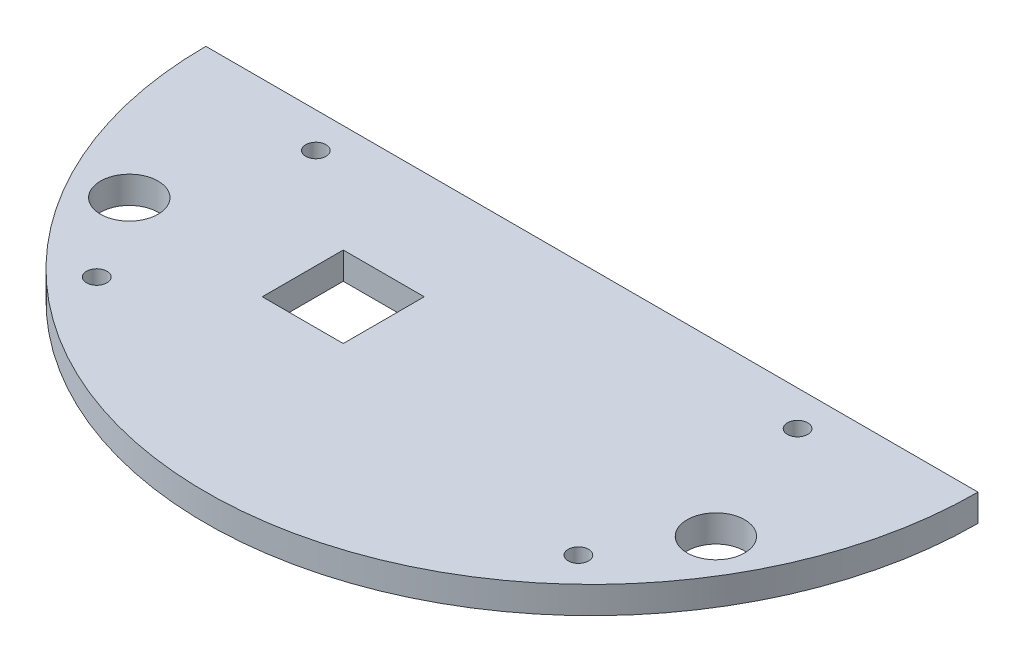
ISO-10303-21;
HEADER;
FILE_DESCRIPTION(('STEP AP214'),'2;1');
FILE_NAME('part.step','',(''),(''),'','','');
FILE_SCHEMA(('AUTOMOTIVE_DESIGN { 1 0 10303 214 1 1 1 1 }'));
ENDSEC;
DATA;
#1=APPLICATION_CONTEXT('core data for automotive mechanical design processes');
#2=APPLICATION_PROTOCOL_DEFINITION('international standard','automotive_design',2000,#1);
#3=PRODUCT_CONTEXT('',#1,'mechanical');
#4=PRODUCT('Part','Part','',(#3));
#5=PRODUCT_RELATED_PRODUCT_CATEGORY('part','',(#4));
#6=PRODUCT_DEFINITION_FORMATION('','',#4);
#7=PRODUCT_DEFINITION_CONTEXT('part definition',#1,'design');
#8=PRODUCT_DEFINITION('design','',#6,#7);
#9=PRODUCT_DEFINITION_SHAPE('','',#8);
#10=(LENGTH_UNIT() NAMED_UNIT(*) SI_UNIT(.MILLI.,.METRE.));
#11=(NAMED_UNIT(*) PLANE_ANGLE_UNIT() SI_UNIT($,.RADIAN.));
#12=(NAMED_UNIT(*) SI_UNIT($,.STERADIAN.) SOLID_ANGLE_UNIT());
#13=UNCERTAINTY_MEASURE_WITH_UNIT(LENGTH_MEASURE(1.E-05),#10,'distance_accuracy_value','');
#14=(GEOMETRIC_REPRESENTATION_CONTEXT(3) GLOBAL_UNCERTAINTY_ASSIGNED_CONTEXT((#13)) GLOBAL_UNIT_ASSIGNED_CONTEXT((#10,
#11,#12)) REPRESENTATION_CONTEXT('',''));
#15=CARTESIAN_POINT('',(0.,0.,0.));
#16=DIRECTION('',(0.,0.,1.));
#17=DIRECTION('',(1.,0.,0.));
#18=AXIS2_PLACEMENT_3D('',#15,#16,#17);
#19=CARTESIAN_POINT('',(0.,4.,0.));
#20=DIRECTION('',(0.,1.,0.));
#21=DIRECTION('',(0.,0.,1.));
#22=AXIS2_PLACEMENT_3D('',#19,#20,#21);
#23=PLANE('',#22);
#24=DIRECTION('',(0.,0.,-1.));
#25=VECTOR('',#24,1.);
#26=CARTESIAN_POINT('',(-8.8560853227291,4.,27.8589477043267));
#27=LINE('',#26,#25);
#28=CARTESIAN_POINT('',(-8.8560853227291,4.,27.8589477043267));
#29=VERTEX_POINT('',#28);
#30=CARTESIAN_POINT('',(-8.8560853227291,4.,15.900742441425));
#31=VERTEX_POINT('',#30);
#32=EDGE_CURVE('E48',#29,#31,#27,.T.);
#33=ORIENTED_EDGE('',*,*,#32,.F.);
#34=DIRECTION('',(1.,0.,0.));
#35=VECTOR('',#34,1.);
#36=CARTESIAN_POINT('',(-20.8142905856308,4.,27.8589477043267));
#37=LINE('',#36,#35);
#38=CARTESIAN_POINT('',(-20.8142905856308,4.,27.8589477043267));
#39=VERTEX_POINT('',#38);
#40=EDGE_CURVE('E104',#39,#29,#37,.T.);
#41=ORIENTED_EDGE('',*,*,#40,.F.);
#42=DIRECTION('',(0.,0.,1.));
#43=VECTOR('',#42,1.);
#44=CARTESIAN_POINT('',(-20.8142905856308,4.,27.8589477043267));
#45=LINE('',#44,#43);
#46=CARTESIAN_POINT('',(-20.8142905856308,4.,15.900742441425));
#47=VERTEX_POINT('',#46);
#48=EDGE_CURVE('E107',#47,#39,#45,.T.);
#49=ORIENTED_EDGE('',*,*,#48,.F.);
#50=DIRECTION('',(-1.,0.,0.));
#51=VECTOR('',#50,1.);
#52=CARTESIAN_POINT('',(-20.8142905856308,4.,15.900742441425));
#53=LINE('',#52,#51);
#54=EDGE_CURVE('E113',#31,#47,#53,.T.);
#55=ORIENTED_EDGE('',*,*,#54,.F.);
#56=EDGE_LOOP('',(#33,#41,#49,#55));
#57=FACE_BOUND('',#56,.T.);
#58=CARTESIAN_POINT('',(35.5570716121792,4.,37.5545789256541));
#59=DIRECTION('',(0.,1.,0.));
#60=DIRECTION('',(0.,0.,1.));
#61=AXIS2_PLACEMENT_3D('',#58,#59,#60);
#62=CIRCLE('',#61,1.5);
#63=CARTESIAN_POINT('',(35.5570716121792,4.,39.0545789256541));
#64=VERTEX_POINT('',#63);
#65=EDGE_CURVE('E127',#64,#64,#62,.T.);
#66=ORIENTED_EDGE('',*,*,#65,.F.);
#67=EDGE_LOOP('',(#66));
#68=FACE_BOUND('',#67,.T.);
#69=CARTESIAN_POINT('',(-35.5570716121792,4.,37.5545789256541));
#70=DIRECTION('',(0.,1.,0.));
#71=DIRECTION('',(0.,0.,1.));
#72=AXIS2_PLACEMENT_3D('',#69,#70,#71);
#73=CIRCLE('',#72,1.5);
#74=CARTESIAN_POINT('',(-35.5570716121792,4.,39.0545789256541));
#75=VERTEX_POINT('',#74);
#76=EDGE_CURVE('E133',#75,#75,#73,.T.);
#77=ORIENTED_EDGE('',*,*,#76,.F.);
#78=EDGE_LOOP('',(#77));
#79=FACE_BOUND('',#78,.T.);
#80=CARTESIAN_POINT('',(-35.5570716121792,4.,5.19850640774449));
#81=DIRECTION('',(0.,1.,0.));
#82=DIRECTION('',(0.,0.,1.));
#83=AXIS2_PLACEMENT_3D('',#80,#81,#82);
#84=CIRCLE('',#83,1.5);
#85=CARTESIAN_POINT('',(-35.5570716121792,4.,6.69850640774449));
#86=VERTEX_POINT('',#85);
#87=EDGE_CURVE('E119',#86,#86,#84,.T.);
#88=ORIENTED_EDGE('',*,*,#87,.F.);
#89=EDGE_LOOP('',(#88));
#90=FACE_BOUND('',#89,.T.);
#91=CARTESIAN_POINT('',(35.5570716121792,4.,5.19850640774448));
#92=DIRECTION('',(0.,1.,0.));
#93=DIRECTION('',(0.,0.,1.));
#94=AXIS2_PLACEMENT_3D('',#91,#92,#93);
#95=CIRCLE('',#94,1.5);
#96=CARTESIAN_POINT('',(35.5570716121792,4.,6.69850640774448));
#97=VERTEX_POINT('',#96);
#98=EDGE_CURVE('E126',#97,#97,#95,.T.);
#99=ORIENTED_EDGE('',*,*,#98,.F.);
#100=EDGE_LOOP('',(#99));
#101=FACE_BOUND('',#100,.T.);
#102=CARTESIAN_POINT('',(43.3012701892219,4.,25.0000000000002));
#103=DIRECTION('',(0.,1.,0.));
#104=DIRECTION('',(0.,0.,1.));
#105=AXIS2_PLACEMENT_3D('',#102,#103,#104);
#106=CIRCLE('',#105,4.25);
#107=CARTESIAN_POINT('',(43.3012701892219,4.,29.2500000000002));
#108=VERTEX_POINT('',#107);
#109=EDGE_CURVE('E153',#108,#108,#106,.T.);
#110=ORIENTED_EDGE('',*,*,#109,.F.);
#111=EDGE_LOOP('',(#110));
#112=FACE_BOUND('',#111,.T.);
#113=CARTESIAN_POINT('',(0.,4.,0.));
#114=DIRECTION('',(0.,1.,0.));
#115=DIRECTION('',(0.,0.,1.));
#116=AXIS2_PLACEMENT_3D('',#113,#114,#115);
#117=CIRCLE('',#116,57.);
#118=CARTESIAN_POINT('',(-57.,4.,0.));
#119=VERTEX_POINT('',#118);
#120=CARTESIAN_POINT('',(57.,4.,0.));
#121=VERTEX_POINT('',#120);
#122=EDGE_CURVE('E159',#119,#121,#117,.T.);
#123=ORIENTED_EDGE('',*,*,#122,.T.);
#124=DIRECTION('',(-1.,0.,0.));
#125=VECTOR('',#124,1.);
#126=CARTESIAN_POINT('',(-57.,4.,0.));
#127=LINE('',#126,#125);
#128=EDGE_CURVE('E162',#121,#119,#127,.T.);
#129=ORIENTED_EDGE('',*,*,#128,.T.);
#130=EDGE_LOOP('',(#123,#129));
#131=FACE_BOUND('',#130,.T.);
#132=CARTESIAN_POINT('',(-43.3012701892219,4.,25.0000000000001));
#133=DIRECTION('',(0.,1.,0.));
#134=DIRECTION('',(0.,0.,1.));
#135=AXIS2_PLACEMENT_3D('',#132,#133,#134);
#136=CIRCLE('',#135,4.25);
#137=CARTESIAN_POINT('',(-43.3012701892219,4.,29.2500000000001));
#138=VERTEX_POINT('',#137);
#139=EDGE_CURVE('E147',#138,#138,#136,.T.);
#140=ORIENTED_EDGE('',*,*,#139,.F.);
#141=EDGE_LOOP('',(#140));
#142=FACE_BOUND('',#141,.T.);
#143=ADVANCED_FACE('F33',(#57,#68,#79,#90,#101,#112,#131,#142),#23,.T.);
#144=CARTESIAN_POINT('',(0.,0.,0.));
#145=DIRECTION('',(0.,1.,0.));
#146=DIRECTION('',(0.,0.,1.));
#147=AXIS2_PLACEMENT_3D('',#144,#145,#146);
#148=PLANE('',#147);
#149=DIRECTION('',(1.,0.,0.));
#150=VECTOR('',#149,1.);
#151=CARTESIAN_POINT('',(-20.8142905856308,0.,27.8589477043267));
#152=LINE('',#151,#150);
#153=CARTESIAN_POINT('',(-20.8142905856308,0.,27.8589477043267));
#154=VERTEX_POINT('',#153);
#155=CARTESIAN_POINT('',(-8.8560853227291,0.,27.8589477043267));
#156=VERTEX_POINT('',#155);
#157=EDGE_CURVE('E94',#154,#156,#152,.T.);
#158=ORIENTED_EDGE('',*,*,#157,.T.);
#159=DIRECTION('',(0.,0.,-1.));
#160=VECTOR('',#159,1.);
#161=CARTESIAN_POINT('',(-8.8560853227291,0.,27.8589477043267));
#162=LINE('',#161,#160);
#163=CARTESIAN_POINT('',(-8.8560853227291,0.,15.900742441425));
#164=VERTEX_POINT('',#163);
#165=EDGE_CURVE('E88',#156,#164,#162,.T.);
#166=ORIENTED_EDGE('',*,*,#165,.T.);
#167=DIRECTION('',(-1.,0.,0.));
#168=VECTOR('',#167,1.);
#169=CARTESIAN_POINT('',(-20.8142905856308,0.,15.900742441425));
#170=LINE('',#169,#168);
#171=CARTESIAN_POINT('',(-20.8142905856308,0.,15.900742441425));
#172=VERTEX_POINT('',#171);
#173=EDGE_CURVE('E97',#164,#172,#170,.T.);
#174=ORIENTED_EDGE('',*,*,#173,.T.);
#175=DIRECTION('',(0.,0.,1.));
#176=VECTOR('',#175,1.);
#177=CARTESIAN_POINT('',(-20.8142905856308,0.,27.8589477043267));
#178=LINE('',#177,#176);
#179=EDGE_CURVE('E56',#172,#154,#178,.T.);
#180=ORIENTED_EDGE('',*,*,#179,.T.);
#181=EDGE_LOOP('',(#158,#166,#174,#180));
#182=FACE_BOUND('',#181,.T.);
#183=CARTESIAN_POINT('',(35.5570716121792,0.,37.5545789256541));
#184=DIRECTION('',(0.,1.,0.));
#185=DIRECTION('',(0.,0.,1.));
#186=AXIS2_PLACEMENT_3D('',#183,#184,#185);
#187=CIRCLE('',#186,1.5);
#188=CARTESIAN_POINT('',(35.5570716121792,0.,39.0545789256541));
#189=VERTEX_POINT('',#188);
#190=EDGE_CURVE('E123',#189,#189,#187,.T.);
#191=ORIENTED_EDGE('',*,*,#190,.T.);
#192=EDGE_LOOP('',(#191));
#193=FACE_BOUND('',#192,.T.);
#194=CARTESIAN_POINT('',(-35.5570716121792,0.,37.5545789256541));
#195=DIRECTION('',(0.,1.,0.));
#196=DIRECTION('',(0.,0.,1.));
#197=AXIS2_PLACEMENT_3D('',#194,#195,#196);
#198=CIRCLE('',#197,1.5);
#199=CARTESIAN_POINT('',(-35.5570716121792,0.,39.0545789256541));
#200=VERTEX_POINT('',#199);
#201=EDGE_CURVE('E130',#200,#200,#198,.T.);
#202=ORIENTED_EDGE('',*,*,#201,.T.);
#203=EDGE_LOOP('',(#202));
#204=FACE_BOUND('',#203,.T.);
#205=CARTESIAN_POINT('',(-35.5570716121792,0.,5.19850640774449));
#206=DIRECTION('',(0.,1.,0.));
#207=DIRECTION('',(0.,0.,1.));
#208=AXIS2_PLACEMENT_3D('',#205,#206,#207);
#209=CIRCLE('',#208,1.5);
#210=CARTESIAN_POINT('',(-35.5570716121792,0.,6.69850640774449));
#211=VERTEX_POINT('',#210);
#212=EDGE_CURVE('E136',#211,#211,#209,.T.);
#213=ORIENTED_EDGE('',*,*,#212,.T.);
#214=EDGE_LOOP('',(#213));
#215=FACE_BOUND('',#214,.T.);
#216=CARTESIAN_POINT('',(35.5570716121792,0.,5.19850640774448));
#217=DIRECTION('',(0.,1.,0.));
#218=DIRECTION('',(0.,0.,1.));
#219=AXIS2_PLACEMENT_3D('',#216,#217,#218);
#220=CIRCLE('',#219,1.5);
#221=CARTESIAN_POINT('',(35.5570716121792,0.,6.69850640774448));
#222=VERTEX_POINT('',#221);
#223=EDGE_CURVE('E141',#222,#222,#220,.T.);
#224=ORIENTED_EDGE('',*,*,#223,.T.);
#225=EDGE_LOOP('',(#224));
#226=FACE_BOUND('',#225,.T.);
#227=CARTESIAN_POINT('',(0.,0.,0.));
#228=DIRECTION('',(0.,1.,0.));
#229=DIRECTION('',(0.,0.,1.));
#230=AXIS2_PLACEMENT_3D('',#227,#228,#229);
#231=CIRCLE('',#230,57.);
#232=CARTESIAN_POINT('',(-57.,0.,0.));
#233=VERTEX_POINT('',#232);
#234=CARTESIAN_POINT('',(57.,0.,0.));
#235=VERTEX_POINT('',#234);
#236=EDGE_CURVE('E156',#233,#235,#231,.T.);
#237=ORIENTED_EDGE('',*,*,#236,.F.);
#238=DIRECTION('',(-1.,0.,0.));
#239=VECTOR('',#238,1.);
#240=CARTESIAN_POINT('',(-57.,0.,0.));
#241=LINE('',#240,#239);
#242=EDGE_CURVE('E163',#235,#233,#241,.T.);
#243=ORIENTED_EDGE('',*,*,#242,.F.);
#244=EDGE_LOOP('',(#237,#243));
#245=FACE_BOUND('',#244,.T.);
#246=CARTESIAN_POINT('',(43.3012701892219,0.,25.0000000000002));
#247=DIRECTION('',(0.,1.,0.));
#248=DIRECTION('',(0.,0.,1.));
#249=AXIS2_PLACEMENT_3D('',#246,#247,#248);
#250=CIRCLE('',#249,4.25);
#251=CARTESIAN_POINT('',(43.3012701892219,0.,29.2500000000002));
#252=VERTEX_POINT('',#251);
#253=EDGE_CURVE('E150',#252,#252,#250,.T.);
#254=ORIENTED_EDGE('',*,*,#253,.T.);
#255=EDGE_LOOP('',(#254));
#256=FACE_BOUND('',#255,.T.);
#257=CARTESIAN_POINT('',(-43.3012701892219,0.,25.0000000000001));
#258=DIRECTION('',(0.,1.,0.));
#259=DIRECTION('',(0.,0.,1.));
#260=AXIS2_PLACEMENT_3D('',#257,#258,#259);
#261=CIRCLE('',#260,4.25);
#262=CARTESIAN_POINT('',(-43.3012701892219,0.,29.2500000000001));
#263=VERTEX_POINT('',#262);
#264=EDGE_CURVE('E144',#263,#263,#261,.T.);
#265=ORIENTED_EDGE('',*,*,#264,.T.);
#266=EDGE_LOOP('',(#265));
#267=FACE_BOUND('',#266,.T.);
#268=ADVANCED_FACE('F101',(#182,#193,#204,#215,#226,#245,#256,#267),#148,.F.);
#269=CARTESIAN_POINT('',(0.,4.,0.));
#270=DIRECTION('',(0.,-1.,0.));
#271=DIRECTION('',(0.,0.,-1.));
#272=AXIS2_PLACEMENT_3D('',#269,#270,#271);
#273=CYLINDRICAL_SURFACE('',#272,57.);
#274=ORIENTED_EDGE('',*,*,#236,.T.);
#275=DIRECTION('',(0.,-1.,0.));
#276=VECTOR('',#275,1.);
#277=CARTESIAN_POINT('',(57.,4.,0.));
#278=LINE('',#277,#276);
#279=EDGE_CURVE('E11',#121,#235,#278,.T.);
#280=ORIENTED_EDGE('',*,*,#279,.F.);
#281=ORIENTED_EDGE('',*,*,#122,.F.);
#282=DIRECTION('',(0.,-1.,0.));
#283=VECTOR('',#282,1.);
#284=CARTESIAN_POINT('',(-57.,4.,0.));
#285=LINE('',#284,#283);
#286=EDGE_CURVE('E41',#119,#233,#285,.T.);
#287=ORIENTED_EDGE('',*,*,#286,.T.);
#288=EDGE_LOOP('',(#274,#280,#281,#287));
#289=FACE_BOUND('',#288,.T.);
#290=ADVANCED_FACE('F35',(#289),#273,.T.);
#291=CARTESIAN_POINT('',(-57.,4.,0.));
#292=DIRECTION('',(0.,0.,1.));
#293=DIRECTION('',(1.,0.,0.));
#294=AXIS2_PLACEMENT_3D('',#291,#292,#293);
#295=PLANE('',#294);
#296=ORIENTED_EDGE('',*,*,#242,.T.);
#297=ORIENTED_EDGE('',*,*,#286,.F.);
#298=ORIENTED_EDGE('',*,*,#128,.F.);
#299=ORIENTED_EDGE('',*,*,#279,.T.);
#300=EDGE_LOOP('',(#296,#297,#298,#299));
#301=FACE_BOUND('',#300,.T.);
#302=ADVANCED_FACE('F176',(#301),#295,.F.);
#303=CARTESIAN_POINT('',(43.3012701892219,4.,25.0000000000002));
#304=DIRECTION('',(0.,-1.,0.));
#305=DIRECTION('',(0.,0.,-1.));
#306=AXIS2_PLACEMENT_3D('',#303,#304,#305);
#307=CYLINDRICAL_SURFACE('',#306,4.25);
#308=ORIENTED_EDGE('',*,*,#109,.T.);
#309=EDGE_LOOP('',(#308));
#310=FACE_BOUND('',#309,.T.);
#311=ORIENTED_EDGE('',*,*,#253,.F.);
#312=EDGE_LOOP('',(#311));
#313=FACE_BOUND('',#312,.T.);
#314=ADVANCED_FACE('F188',(#310,#313),#307,.F.);
#315=CARTESIAN_POINT('',(-43.3012701892219,4.,25.0000000000001));
#316=DIRECTION('',(0.,-1.,0.));
#317=DIRECTION('',(0.,0.,-1.));
#318=AXIS2_PLACEMENT_3D('',#315,#316,#317);
#319=CYLINDRICAL_SURFACE('',#318,4.25);
#320=ORIENTED_EDGE('',*,*,#139,.T.);
#321=EDGE_LOOP('',(#320));
#322=FACE_BOUND('',#321,.T.);
#323=ORIENTED_EDGE('',*,*,#264,.F.);
#324=EDGE_LOOP('',(#323));
#325=FACE_BOUND('',#324,.T.);
#326=ADVANCED_FACE('F184',(#322,#325),#319,.F.);
#327=CARTESIAN_POINT('',(35.5570716121792,0.,5.19850640774448));
#328=DIRECTION('',(0.,1.,0.));
#329=DIRECTION('',(0.,0.,1.));
#330=AXIS2_PLACEMENT_3D('',#327,#328,#329);
#331=CYLINDRICAL_SURFACE('',#330,1.5);
#332=ORIENTED_EDGE('',*,*,#223,.F.);
#333=EDGE_LOOP('',(#332));
#334=FACE_BOUND('',#333,.T.);
#335=ORIENTED_EDGE('',*,*,#98,.T.);
#336=EDGE_LOOP('',(#335));
#337=FACE_BOUND('',#336,.T.);
#338=ADVANCED_FACE('F187',(#334,#337),#331,.F.);
#339=CARTESIAN_POINT('',(-35.5570716121792,0.,5.19850640774449));
#340=DIRECTION('',(0.,1.,0.));
#341=DIRECTION('',(0.,0.,1.));
#342=AXIS2_PLACEMENT_3D('',#339,#340,#341);
#343=CYLINDRICAL_SURFACE('',#342,1.5);
#344=ORIENTED_EDGE('',*,*,#212,.F.);
#345=EDGE_LOOP('',(#344));
#346=FACE_BOUND('',#345,.T.);
#347=ORIENTED_EDGE('',*,*,#87,.T.);
#348=EDGE_LOOP('',(#347));
#349=FACE_BOUND('',#348,.T.);
#350=ADVANCED_FACE('F209',(#346,#349),#343,.F.);
#351=CARTESIAN_POINT('',(-35.5570716121792,0.,37.5545789256541));
#352=DIRECTION('',(0.,1.,0.));
#353=DIRECTION('',(0.,0.,1.));
#354=AXIS2_PLACEMENT_3D('',#351,#352,#353);
#355=CYLINDRICAL_SURFACE('',#354,1.5);
#356=ORIENTED_EDGE('',*,*,#201,.F.);
#357=EDGE_LOOP('',(#356));
#358=FACE_BOUND('',#357,.T.);
#359=ORIENTED_EDGE('',*,*,#76,.T.);
#360=EDGE_LOOP('',(#359));
#361=FACE_BOUND('',#360,.T.);
#362=ADVANCED_FACE('F213',(#358,#361),#355,.F.);
#363=CARTESIAN_POINT('',(35.5570716121792,0.,37.5545789256541));
#364=DIRECTION('',(0.,1.,0.));
#365=DIRECTION('',(0.,0.,1.));
#366=AXIS2_PLACEMENT_3D('',#363,#364,#365);
#367=CYLINDRICAL_SURFACE('',#366,1.5);
#368=ORIENTED_EDGE('',*,*,#190,.F.);
#369=EDGE_LOOP('',(#368));
#370=FACE_BOUND('',#369,.T.);
#371=ORIENTED_EDGE('',*,*,#65,.T.);
#372=EDGE_LOOP('',(#371));
#373=FACE_BOUND('',#372,.T.);
#374=ADVANCED_FACE('F217',(#370,#373),#367,.F.);
#375=CARTESIAN_POINT('',(-8.8560853227291,0.,27.8589477043267));
#376=DIRECTION('',(1.,0.,0.));
#377=DIRECTION('',(0.,0.,-1.));
#378=AXIS2_PLACEMENT_3D('',#375,#376,#377);
#379=PLANE('',#378);
#380=ORIENTED_EDGE('',*,*,#32,.T.);
#381=DIRECTION('',(0.,1.,0.));
#382=VECTOR('',#381,1.);
#383=CARTESIAN_POINT('',(-8.8560853227291,0.,15.900742441425));
#384=LINE('',#383,#382);
#385=EDGE_CURVE('E84',#164,#31,#384,.T.);
#386=ORIENTED_EDGE('',*,*,#385,.F.);
#387=ORIENTED_EDGE('',*,*,#165,.F.);
#388=DIRECTION('',(0.,1.,0.));
#389=VECTOR('',#388,1.);
#390=CARTESIAN_POINT('',(-8.8560853227291,0.,27.8589477043267));
#391=LINE('',#390,#389);
#392=EDGE_CURVE('E117',#156,#29,#391,.T.);
#393=ORIENTED_EDGE('',*,*,#392,.T.);
#394=EDGE_LOOP('',(#380,#386,#387,#393));
#395=FACE_BOUND('',#394,.T.);
#396=ADVANCED_FACE('F86',(#395),#379,.F.);
#397=CARTESIAN_POINT('',(-20.8142905856308,0.,27.8589477043267));
#398=DIRECTION('',(0.,0.,1.));
#399=DIRECTION('',(1.,0.,0.));
#400=AXIS2_PLACEMENT_3D('',#397,#398,#399);
#401=PLANE('',#400);
#402=ORIENTED_EDGE('',*,*,#40,.T.);
#403=ORIENTED_EDGE('',*,*,#392,.F.);
#404=ORIENTED_EDGE('',*,*,#157,.F.);
#405=DIRECTION('',(0.,1.,0.));
#406=VECTOR('',#405,1.);
#407=CARTESIAN_POINT('',(-20.8142905856308,0.,27.8589477043267));
#408=LINE('',#407,#406);
#409=EDGE_CURVE('E120',#154,#39,#408,.T.);
#410=ORIENTED_EDGE('',*,*,#409,.T.);
#411=EDGE_LOOP('',(#402,#403,#404,#410));
#412=FACE_BOUND('',#411,.T.);
#413=ADVANCED_FACE('F224',(#412),#401,.F.);
#414=CARTESIAN_POINT('',(-20.8142905856308,0.,27.8589477043267));
#415=DIRECTION('',(-1.,0.,0.));
#416=DIRECTION('',(0.,0.,1.));
#417=AXIS2_PLACEMENT_3D('',#414,#415,#416);
#418=PLANE('',#417);
#419=ORIENTED_EDGE('',*,*,#48,.T.);
#420=ORIENTED_EDGE('',*,*,#409,.F.);
#421=ORIENTED_EDGE('',*,*,#179,.F.);
#422=DIRECTION('',(0.,1.,0.));
#423=VECTOR('',#422,1.);
#424=CARTESIAN_POINT('',(-20.8142905856308,0.,15.900742441425));
#425=LINE('',#424,#423);
#426=EDGE_CURVE('E93',#172,#47,#425,.T.);
#427=ORIENTED_EDGE('',*,*,#426,.T.);
#428=EDGE_LOOP('',(#419,#420,#421,#427));
#429=FACE_BOUND('',#428,.T.);
#430=ADVANCED_FACE('F227',(#429),#418,.F.);
#431=CARTESIAN_POINT('',(-20.8142905856308,0.,15.900742441425));
#432=DIRECTION('',(0.,0.,-1.));
#433=DIRECTION('',(-1.,0.,0.));
#434=AXIS2_PLACEMENT_3D('',#431,#432,#433);
#435=PLANE('',#434);
#436=ORIENTED_EDGE('',*,*,#54,.T.);
#437=ORIENTED_EDGE('',*,*,#426,.F.);
#438=ORIENTED_EDGE('',*,*,#173,.F.);
#439=ORIENTED_EDGE('',*,*,#385,.T.);
#440=EDGE_LOOP('',(#436,#437,#438,#439));
#441=FACE_BOUND('',#440,.T.);
#442=ADVANCED_FACE('F98',(#441),#435,.F.);
#443=CLOSED_SHELL('',(#143,#268,#290,#302,#314,#326,#338,#350,#362,#374,#396,#413,#430,#442));
#444=MANIFOLD_SOLID_BREP('B2',#443);
#445=ADVANCED_BREP_SHAPE_REPRESENTATION('',(#18,#444),#14);
#446=SHAPE_DEFINITION_REPRESENTATION(#9,#445);
ENDSEC;
END-ISO-10303-21;
